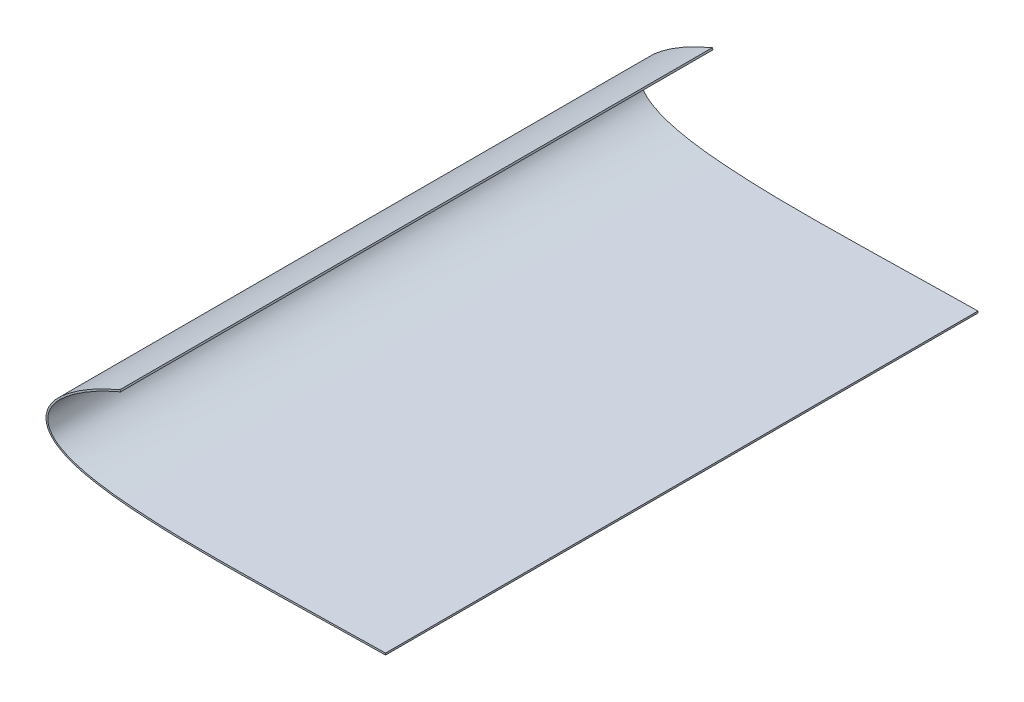
ISO-10303-21;
HEADER;
FILE_DESCRIPTION(('STEP AP214'),'2;1');
FILE_NAME('part.step','',(''),(''),'','','');
FILE_SCHEMA(('AUTOMOTIVE_DESIGN { 1 0 10303 214 1 1 1 1 }'));
ENDSEC;
DATA;
#1=APPLICATION_CONTEXT('core data for automotive mechanical design processes');
#2=APPLICATION_PROTOCOL_DEFINITION('international standard','automotive_design',2000,#1);
#3=PRODUCT_CONTEXT('',#1,'mechanical');
#4=PRODUCT('Part','Part','',(#3));
#5=PRODUCT_RELATED_PRODUCT_CATEGORY('part','',(#4));
#6=PRODUCT_DEFINITION_FORMATION('','',#4);
#7=PRODUCT_DEFINITION_CONTEXT('part definition',#1,'design');
#8=PRODUCT_DEFINITION('design','',#6,#7);
#9=PRODUCT_DEFINITION_SHAPE('','',#8);
#10=(LENGTH_UNIT() NAMED_UNIT(*) SI_UNIT(.MILLI.,.METRE.));
#11=(NAMED_UNIT(*) PLANE_ANGLE_UNIT() SI_UNIT($,.RADIAN.));
#12=(NAMED_UNIT(*) SI_UNIT($,.STERADIAN.) SOLID_ANGLE_UNIT());
#13=UNCERTAINTY_MEASURE_WITH_UNIT(LENGTH_MEASURE(1.E-05),#10,'distance_accuracy_value','');
#14=(GEOMETRIC_REPRESENTATION_CONTEXT(3) GLOBAL_UNCERTAINTY_ASSIGNED_CONTEXT((#13)) GLOBAL_UNIT_ASSIGNED_CONTEXT((#10,
#11,#12)) REPRESENTATION_CONTEXT('',''));
#15=CARTESIAN_POINT('',(0.,0.,0.));
#16=DIRECTION('',(0.,0.,1.));
#17=DIRECTION('',(1.,0.,0.));
#18=AXIS2_PLACEMENT_3D('',#15,#16,#17);
#19=CARTESIAN_POINT('',(52.279784263396,54.6368495583963,174.625));
#20=CARTESIAN_POINT('',(51.9842375839482,54.5110568205723,174.625));
#21=CARTESIAN_POINT('',(50.7698703349108,53.9873361103405,174.625));
#22=CARTESIAN_POINT('',(48.7262842208841,53.0365372041149,174.625));
#23=CARTESIAN_POINT('',(46.1985966340727,51.7856149808949,174.625));
#24=CARTESIAN_POINT('',(43.8513955335234,50.5628357336957,174.625));
#25=CARTESIAN_POINT('',(41.7065223147171,49.2753909988389,174.625));
#26=CARTESIAN_POINT('',(39.733394775625,48.0292859809215,174.625));
#27=CARTESIAN_POINT('',(37.9660150500307,46.7508633129765,174.625));
#28=CARTESIAN_POINT('',(36.3542569420481,45.5542620285061,174.625));
#29=CARTESIAN_POINT('',(34.9506042386984,44.3247206516308,174.625));
#30=CARTESIAN_POINT('',(33.7310058534112,43.1375529445579,174.625));
#31=CARTESIAN_POINT('',(32.6875400615619,41.9646967740159,174.625));
#32=CARTESIAN_POINT('',(31.8700494946095,40.7950980760292,174.625));
#33=CARTESIAN_POINT('',(31.2049081040977,39.6569207752362,174.625));
#34=CARTESIAN_POINT('',(30.8086033681005,38.5196104238674,174.625));
#35=CARTESIAN_POINT('',(30.5235691356459,37.4345389132446,174.625));
#36=CARTESIAN_POINT('',(30.4310087825791,36.3627840788217,174.625));
#37=CARTESIAN_POINT('',(30.615024145006,35.32934754233,174.625));
#38=CARTESIAN_POINT('',(30.8927865257014,34.3177616701598,174.625));
#39=CARTESIAN_POINT('',(31.4496102095806,33.3932258153343,174.625));
#40=CARTESIAN_POINT('',(32.1506525347102,32.5234150336729,174.625));
#41=CARTESIAN_POINT('',(32.9766589610015,31.6506119978175,174.625));
#42=CARTESIAN_POINT('',(34.0717450313561,30.9441424330286,174.625));
#43=CARTESIAN_POINT('',(35.2743301471047,30.2147424818531,174.625));
#44=CARTESIAN_POINT('',(36.6606910218293,29.5585884336969,174.625));
#45=CARTESIAN_POINT('',(38.2298639762326,28.9795874382233,174.625));
#46=CARTESIAN_POINT('',(39.9603274946295,28.409153359317,174.625));
#47=CARTESIAN_POINT('',(41.862111381165,27.9076892579437,174.625));
#48=CARTESIAN_POINT('',(43.9308294935862,27.4768136073615,174.625));
#49=CARTESIAN_POINT('',(46.1430586763678,27.0544798825399,174.625));
#50=CARTESIAN_POINT('',(48.5261088087182,26.711860726111,174.625));
#51=CARTESIAN_POINT('',(51.0445678607058,26.3949027035553,174.625));
#52=CARTESIAN_POINT('',(53.7226630674446,26.06649037235,174.625));
#53=CARTESIAN_POINT('',(56.5512320841555,25.9162004583246,174.625));
#54=CARTESIAN_POINT('',(59.5207885191564,25.6696578391719,174.625));
#55=CARTESIAN_POINT('',(62.6352898997253,25.564258659258,174.625));
#56=CARTESIAN_POINT('',(65.8829117322227,25.3781107864141,174.625));
#57=CARTESIAN_POINT('',(69.2727213948618,25.3117021246645,174.625));
#58=CARTESIAN_POINT('',(72.7875926931949,25.2447227423576,174.625));
#59=CARTESIAN_POINT('',(76.4410168529708,25.2177536800816,174.625));
#60=CARTESIAN_POINT('',(80.2079561151313,25.2059255566866,174.625));
#61=CARTESIAN_POINT('',(84.0995890603195,25.2542808010686,174.625));
#62=CARTESIAN_POINT('',(88.093376992889,25.2344045238007,174.625));
#63=CARTESIAN_POINT('',(92.2094832757753,25.3673234412305,174.625));
#64=CARTESIAN_POINT('',(96.427933938967,25.3704722092847,174.625));
#65=CARTESIAN_POINT('',(100.757397226996,25.4491366982306,174.625));
#66=CARTESIAN_POINT('',(105.17451648858,25.5547340767129,174.625));
#67=CARTESIAN_POINT('',(109.691566336199,25.6470871193837,174.625));
#68=CARTESIAN_POINT('',(114.294867366389,25.7362480016773,174.625));
#69=CARTESIAN_POINT('',(118.998236922616,25.8022193393076,174.625));
#70=CARTESIAN_POINT('',(123.786466612625,25.9376003922086,174.625));
#71=CARTESIAN_POINT('',(127.652050322274,25.978617474138,174.625));
#72=CARTESIAN_POINT('',(129.916088327162,26.0062875546644,174.625));
#73=CARTESIAN_POINT('',(130.555209424101,26.0143218854273,174.625));
#74=B_SPLINE_CURVE_WITH_KNOTS('',3,(#19,#20,#21,#22,#23,#24,#25,#26,#27,#28,#29,#30,#31,#32,#33,
#34,#35,#36,#37,#38,#39,#40,#41,#42,#43,#44,#45,#46,#47,#48,#49,#50,#51,#52,#53,#54,#55,#56,#57,
#58,#59,#60,#61,#62,#63,#64,#65,#66,#67,#68,#69,#70,#71,#72,#73),.UNSPECIFIED.,.F.,.F.,(4,1,1,1,
1,1,1,1,1,1,1,1,1,1,1,1,1,1,1,1,1,1,1,1,1,1,1,1,1,1,1,1,1,1,1,1,1,1,1,1,1,1,1,1,1,1,1,1,1,1,1,1,
4),(14.1344292083141,14.1723678306515,14.2906368426527,14.4005642750807,14.5054914593558,
14.6030933056501,14.6959497647682,14.7810065128842,14.8606668744199,14.932933187457,
15.0011950186659,15.0616397239758,15.1179775656103,15.1695757089876,15.2167045451708,
15.2596692469617,15.3020092469619,15.3423908516848,15.383061745454,15.4251745843519,
15.4685835050936,15.5151435437538,15.5662226823522,15.6217218895538,15.681367848344,
15.7469541944843,15.8191910050454,15.8965021064469,15.9790921784904,16.0687366540585,
16.162461376517,16.2633705099003,16.3685817203289,16.4810017203293,16.59780172033,
16.7204764773092,16.848989654843,16.9819779445536,17.1208699169633,17.2642178294,
17.4134881037355,17.5657766719204,17.7238886727302,17.8851509435814,18.0521088221016,
18.2220969675706,18.3965776576198,18.5739661555559,18.7557170983324,18.9403767994038,
19.1295299278471,19.3214630182723,19.3969558554318),.UNSPECIFIED.);
#75=DIRECTION('',(0.,0.,-1.));
#76=VECTOR('',#75,1.);
#77=SURFACE_OF_LINEAR_EXTRUSION('',#74,#76);
#78=CARTESIAN_POINT('',(52.279784263396,54.6368495583963,0.));
#79=CARTESIAN_POINT('',(51.9842375839482,54.5110568205723,0.));
#80=CARTESIAN_POINT('',(50.7698703349108,53.9873361103405,0.));
#81=CARTESIAN_POINT('',(48.7262842208841,53.0365372041149,0.));
#82=CARTESIAN_POINT('',(46.1985966340727,51.7856149808949,0.));
#83=CARTESIAN_POINT('',(43.8513955335234,50.5628357336957,0.));
#84=CARTESIAN_POINT('',(41.7065223147171,49.2753909988389,0.));
#85=CARTESIAN_POINT('',(39.733394775625,48.0292859809215,0.));
#86=CARTESIAN_POINT('',(37.9660150500307,46.7508633129765,0.));
#87=CARTESIAN_POINT('',(36.3542569420481,45.5542620285061,0.));
#88=CARTESIAN_POINT('',(34.9506042386984,44.3247206516308,0.));
#89=CARTESIAN_POINT('',(33.7310058534112,43.1375529445579,0.));
#90=CARTESIAN_POINT('',(32.6875400615619,41.9646967740159,0.));
#91=CARTESIAN_POINT('',(31.8700494946095,40.7950980760292,0.));
#92=CARTESIAN_POINT('',(31.2049081040977,39.6569207752362,0.));
#93=CARTESIAN_POINT('',(30.8086033681005,38.5196104238674,0.));
#94=CARTESIAN_POINT('',(30.5235691356459,37.4345389132446,0.));
#95=CARTESIAN_POINT('',(30.4310087825791,36.3627840788217,0.));
#96=CARTESIAN_POINT('',(30.615024145006,35.32934754233,0.));
#97=CARTESIAN_POINT('',(30.8927865257014,34.3177616701598,0.));
#98=CARTESIAN_POINT('',(31.4496102095806,33.3932258153343,0.));
#99=CARTESIAN_POINT('',(32.1506525347102,32.5234150336729,0.));
#100=CARTESIAN_POINT('',(32.9766589610015,31.6506119978175,0.));
#101=CARTESIAN_POINT('',(34.0717450313561,30.9441424330286,0.));
#102=CARTESIAN_POINT('',(35.2743301471047,30.2147424818531,0.));
#103=CARTESIAN_POINT('',(36.6606910218293,29.5585884336969,0.));
#104=CARTESIAN_POINT('',(38.2298639762326,28.9795874382233,0.));
#105=CARTESIAN_POINT('',(39.9603274946295,28.409153359317,0.));
#106=CARTESIAN_POINT('',(41.862111381165,27.9076892579437,0.));
#107=CARTESIAN_POINT('',(43.9308294935862,27.4768136073615,0.));
#108=CARTESIAN_POINT('',(46.1430586763678,27.0544798825399,0.));
#109=CARTESIAN_POINT('',(48.5261088087182,26.711860726111,0.));
#110=CARTESIAN_POINT('',(51.0445678607058,26.3949027035553,0.));
#111=CARTESIAN_POINT('',(53.7226630674446,26.06649037235,0.));
#112=CARTESIAN_POINT('',(56.5512320841555,25.9162004583246,0.));
#113=CARTESIAN_POINT('',(59.5207885191564,25.6696578391719,0.));
#114=CARTESIAN_POINT('',(62.6352898997253,25.564258659258,0.));
#115=CARTESIAN_POINT('',(65.8829117322227,25.3781107864141,0.));
#116=CARTESIAN_POINT('',(69.2727213948618,25.3117021246645,0.));
#117=CARTESIAN_POINT('',(72.7875926931949,25.2447227423576,0.));
#118=CARTESIAN_POINT('',(76.4410168529708,25.2177536800816,0.));
#119=CARTESIAN_POINT('',(80.2079561151313,25.2059255566866,0.));
#120=CARTESIAN_POINT('',(84.0995890603195,25.2542808010686,0.));
#121=CARTESIAN_POINT('',(88.093376992889,25.2344045238007,0.));
#122=CARTESIAN_POINT('',(92.2094832757753,25.3673234412305,0.));
#123=CARTESIAN_POINT('',(96.427933938967,25.3704722092847,0.));
#124=CARTESIAN_POINT('',(100.757397226996,25.4491366982306,0.));
#125=CARTESIAN_POINT('',(105.17451648858,25.5547340767129,0.));
#126=CARTESIAN_POINT('',(109.691566336199,25.6470871193837,0.));
#127=CARTESIAN_POINT('',(114.294867366389,25.7362480016773,0.));
#128=CARTESIAN_POINT('',(118.998236922616,25.8022193393076,0.));
#129=CARTESIAN_POINT('',(123.786466612625,25.9376003922086,0.));
#130=CARTESIAN_POINT('',(127.652050322274,25.978617474138,0.));
#131=CARTESIAN_POINT('',(129.916088327162,26.0062875546644,0.));
#132=CARTESIAN_POINT('',(130.555209424101,26.0143218854273,0.));
#133=B_SPLINE_CURVE_WITH_KNOTS('',3,(#78,#79,#80,#81,#82,#83,#84,#85,#86,#87,#88,#89,#90,#91,
#92,#93,#94,#95,#96,#97,#98,#99,#100,#101,#102,#103,#104,#105,#106,#107,#108,#109,#110,#111,
#112,#113,#114,#115,#116,#117,#118,#119,#120,#121,#122,#123,#124,#125,#126,#127,#128,#129,#130,
#131,#132),.UNSPECIFIED.,.F.,.F.,(4,1,1,1,1,1,1,1,1,1,1,1,1,1,1,1,1,1,1,1,1,1,1,1,1,1,1,1,1,1,1,
1,1,1,1,1,1,1,1,1,1,1,1,1,1,1,1,1,1,1,1,1,4),(14.1344292083141,14.1723678306515,
14.2906368426527,14.4005642750807,14.5054914593558,14.6030933056501,14.6959497647682,
14.7810065128842,14.8606668744199,14.932933187457,15.0011950186659,15.0616397239758,
15.1179775656103,15.1695757089876,15.2167045451708,15.2596692469617,15.3020092469619,
15.3423908516848,15.383061745454,15.4251745843519,15.4685835050936,15.5151435437538,
15.5662226823522,15.6217218895538,15.681367848344,15.7469541944843,15.8191910050454,
15.8965021064469,15.9790921784904,16.0687366540585,16.162461376517,16.2633705099003,
16.3685817203289,16.4810017203293,16.59780172033,16.7204764773092,16.848989654843,
16.9819779445536,17.1208699169633,17.2642178294,17.4134881037355,17.5657766719204,
17.7238886727302,17.8851509435814,18.0521088221016,18.2220969675706,18.3965776576198,
18.5739661555559,18.7557170983324,18.9403767994038,19.1295299278471,19.3214630182723,
19.3969558554318),.UNSPECIFIED.);
#134=CARTESIAN_POINT('',(52.279784263396,54.6368495583963,0.));
#135=VERTEX_POINT('',#134);
#136=CARTESIAN_POINT('',(130.555209424101,26.0143218854273,0.));
#137=VERTEX_POINT('',#136);
#138=EDGE_CURVE('E116',#135,#137,#133,.T.);
#139=ORIENTED_EDGE('',*,*,#138,.T.);
#140=DIRECTION('',(0.,0.,-1.));
#141=VECTOR('',#140,1.);
#142=CARTESIAN_POINT('',(130.555209424101,26.0143218854273,174.625));
#143=LINE('',#142,#141);
#144=CARTESIAN_POINT('',(130.555209424101,26.0143218854273,174.625));
#145=VERTEX_POINT('',#144);
#146=EDGE_CURVE('E11',#145,#137,#143,.T.);
#147=ORIENTED_EDGE('',*,*,#146,.F.);
#148=CARTESIAN_POINT('',(52.279784263396,54.6368495583963,174.625));
#149=VERTEX_POINT('',#148);
#150=EDGE_CURVE('E85',#149,#145,#74,.T.);
#151=ORIENTED_EDGE('',*,*,#150,.F.);
#152=DIRECTION('',(0.,0.,-1.));
#153=VECTOR('',#152,1.);
#154=CARTESIAN_POINT('',(52.279784263396,54.6368495583963,174.625));
#155=LINE('',#154,#153);
#156=EDGE_CURVE('E93',#149,#135,#155,.T.);
#157=ORIENTED_EDGE('',*,*,#156,.T.);
#158=EDGE_LOOP('',(#139,#147,#151,#157));
#159=FACE_BOUND('',#158,.T.);
#160=ADVANCED_FACE('F33',(#159),#77,.F.);
#161=CARTESIAN_POINT('',(130.548667937939,26.5346890341615,174.625));
#162=DIRECTION('',(-0.999920995533172,-0.0125699121695554,0.));
#163=DIRECTION('',(0.0125699121695555,-0.999920995533172,0.));
#164=AXIS2_PLACEMENT_3D('',#161,#162,#163);
#165=PLANE('',#164);
#166=DIRECTION('',(-0.0125699121695554,0.999920995533172,0.));
#167=VECTOR('',#166,1.);
#168=CARTESIAN_POINT('',(130.548667937939,26.5346890341615,0.));
#169=LINE('',#168,#167);
#170=CARTESIAN_POINT('',(130.548667937939,26.5346890341615,0.));
#171=VERTEX_POINT('',#170);
#172=EDGE_CURVE('E89',#137,#171,#169,.T.);
#173=ORIENTED_EDGE('',*,*,#172,.T.);
#174=DIRECTION('',(0.,0.,-1.));
#175=VECTOR('',#174,1.);
#176=CARTESIAN_POINT('',(130.548667937939,26.5346890341615,174.625));
#177=LINE('',#176,#175);
#178=CARTESIAN_POINT('',(130.548667937939,26.5346890341615,174.625));
#179=VERTEX_POINT('',#178);
#180=EDGE_CURVE('E42',#179,#171,#177,.T.);
#181=ORIENTED_EDGE('',*,*,#180,.F.);
#182=DIRECTION('',(-0.0125699121695554,0.999920995533172,0.));
#183=VECTOR('',#182,1.);
#184=CARTESIAN_POINT('',(130.548667937939,26.5346890341615,174.625));
#185=LINE('',#184,#183);
#186=EDGE_CURVE('E80',#145,#179,#185,.T.);
#187=ORIENTED_EDGE('',*,*,#186,.F.);
#188=ORIENTED_EDGE('',*,*,#146,.T.);
#189=EDGE_LOOP('',(#173,#181,#187,#188));
#190=FACE_BOUND('',#189,.T.);
#191=ADVANCED_FACE('F88',(#190),#165,.F.);
#192=CARTESIAN_POINT('',(130.548667937939,26.5346890341615,174.625));
#193=CARTESIAN_POINT('',(124.555343756834,26.4491026396697,174.625));
#194=CARTESIAN_POINT('',(118.563284111257,26.3143159513226,174.625));
#195=CARTESIAN_POINT('',(102.663997770162,26.0308132515019,174.625));
#196=CARTESIAN_POINT('',(92.7642170680979,25.8004249943056,174.625));
#197=CARTESIAN_POINT('',(77.9969063518174,25.7164614683827,174.625));
#198=CARTESIAN_POINT('',(73.1544000856876,25.7277180879495,174.625));
#199=CARTESIAN_POINT('',(63.4698219147655,25.9577443343307,174.625));
#200=CARTESIAN_POINT('',(58.6332063621148,26.2110915671319,174.625));
#201=CARTESIAN_POINT('',(51.4046880593991,26.8525814791273,174.625));
#202=CARTESIAN_POINT('',(49.0055614718312,27.1183583047564,174.625));
#203=CARTESIAN_POINT('',(44.2531218048478,27.8939248842433,174.625));
#204=CARTESIAN_POINT('',(41.8889325759947,28.3539185666942,174.625));
#205=CARTESIAN_POINT('',(38.5092631099543,29.4115926421441,174.625));
#206=CARTESIAN_POINT('',(37.4227007969777,29.7823005654821,174.625));
#207=CARTESIAN_POINT('',(35.3858591876671,30.721401098096,174.625));
#208=CARTESIAN_POINT('',(34.3648285070924,31.2789602327156,174.625));
#209=CARTESIAN_POINT('',(32.4947462546347,32.7613334870106,174.625));
#210=CARTESIAN_POINT('',(31.6368907574047,33.8105567726051,174.625));
#211=CARTESIAN_POINT('',(30.8417084343807,36.1863154881374,174.625));
#212=CARTESIAN_POINT('',(30.9740163157737,37.4872010536399,174.625));
#213=CARTESIAN_POINT('',(32.1505911551316,40.6939371356345,174.625));
#214=CARTESIAN_POINT('',(33.6489329297031,42.4217978213159,174.625));
#215=CARTESIAN_POINT('',(37.2937741895299,45.7686663906626,174.625));
#216=CARTESIAN_POINT('',(39.569261895129,47.3620885973542,174.625));
#217=CARTESIAN_POINT('',(45.1489216631899,50.7908001205631,174.625));
#218=CARTESIAN_POINT('',(48.5985134973385,52.4662096211677,174.625));
#219=CARTESIAN_POINT('',(52.2115751343648,54.0523162100325,174.625));
#220=CARTESIAN_POINT('',(52.3312267033242,54.1046027201561,174.625));
#221=CARTESIAN_POINT('',(52.4509665908119,54.1566903924833,174.625));
#222=B_SPLINE_CURVE_WITH_KNOTS('',3,(#192,#193,#194,#195,#196,#197,#198,#199,#200,#201,#202,
#203,#204,#205,#206,#207,#208,#209,#210,#211,#212,#213,#214,#215,#216,#217,#218,#219,#220,#221),
.UNSPECIFIED.,.F.,.F.,(4,2,2,2,2,2,2,2,2,2,2,2,2,2,4),(14.135708649313,14.8434402693259,
16.0140470282882,16.5870564413242,17.1600658543601,17.446570560878,17.733075267396,
17.8698354280187,18.0065955886415,18.1697632211686,18.3329308536956,18.6002796477227,
18.9285117511339,19.3814841253363,19.3969867417204),.UNSPECIFIED.);
#223=DIRECTION('',(0.,0.,-1.));
#224=VECTOR('',#223,1.);
#225=SURFACE_OF_LINEAR_EXTRUSION('',#222,#224);
#226=CARTESIAN_POINT('',(130.548667937939,26.5346890341615,0.));
#227=CARTESIAN_POINT('',(124.555343756834,26.4491026396697,0.));
#228=CARTESIAN_POINT('',(118.563284111257,26.3143159513226,0.));
#229=CARTESIAN_POINT('',(102.663997770162,26.0308132515019,0.));
#230=CARTESIAN_POINT('',(92.7642170680979,25.8004249943056,0.));
#231=CARTESIAN_POINT('',(77.9969063518174,25.7164614683827,0.));
#232=CARTESIAN_POINT('',(73.1544000856876,25.7277180879495,0.));
#233=CARTESIAN_POINT('',(63.4698219147655,25.9577443343307,0.));
#234=CARTESIAN_POINT('',(58.6332063621148,26.2110915671319,0.));
#235=CARTESIAN_POINT('',(51.4046880593991,26.8525814791273,0.));
#236=CARTESIAN_POINT('',(49.0055614718312,27.1183583047564,0.));
#237=CARTESIAN_POINT('',(44.2531218048478,27.8939248842433,0.));
#238=CARTESIAN_POINT('',(41.8889325759947,28.3539185666942,0.));
#239=CARTESIAN_POINT('',(38.5092631099543,29.4115926421441,0.));
#240=CARTESIAN_POINT('',(37.4227007969777,29.7823005654821,0.));
#241=CARTESIAN_POINT('',(35.3858591876671,30.721401098096,0.));
#242=CARTESIAN_POINT('',(34.3648285070924,31.2789602327156,0.));
#243=CARTESIAN_POINT('',(32.4947462546347,32.7613334870106,0.));
#244=CARTESIAN_POINT('',(31.6368907574047,33.8105567726051,0.));
#245=CARTESIAN_POINT('',(30.8417084343807,36.1863154881374,0.));
#246=CARTESIAN_POINT('',(30.9740163157737,37.4872010536399,0.));
#247=CARTESIAN_POINT('',(32.1505911551316,40.6939371356345,0.));
#248=CARTESIAN_POINT('',(33.6489329297031,42.4217978213159,0.));
#249=CARTESIAN_POINT('',(37.2937741895299,45.7686663906626,0.));
#250=CARTESIAN_POINT('',(39.569261895129,47.3620885973542,0.));
#251=CARTESIAN_POINT('',(45.1489216631899,50.7908001205631,0.));
#252=CARTESIAN_POINT('',(48.5985134973385,52.4662096211677,0.));
#253=CARTESIAN_POINT('',(52.2115751343648,54.0523162100325,0.));
#254=CARTESIAN_POINT('',(52.3312267033242,54.1046027201561,0.));
#255=CARTESIAN_POINT('',(52.4509665908119,54.1566903924833,0.));
#256=B_SPLINE_CURVE_WITH_KNOTS('',3,(#226,#227,#228,#229,#230,#231,#232,#233,#234,#235,#236,
#237,#238,#239,#240,#241,#242,#243,#244,#245,#246,#247,#248,#249,#250,#251,#252,#253,#254,#255),
.UNSPECIFIED.,.F.,.F.,(4,2,2,2,2,2,2,2,2,2,2,2,2,2,4),(14.135708649313,14.8434402693259,
16.0140470282882,16.5870564413242,17.1600658543601,17.446570560878,17.733075267396,
17.8698354280187,18.0065955886415,18.1697632211686,18.3329308536956,18.6002796477227,
18.9285117511339,19.3814841253363,19.3969867417204),.UNSPECIFIED.);
#257=CARTESIAN_POINT('',(52.4509665908119,54.1566903924833,0.));
#258=VERTEX_POINT('',#257);
#259=EDGE_CURVE('E67',#171,#258,#256,.T.);
#260=ORIENTED_EDGE('',*,*,#259,.T.);
#261=DIRECTION('',(0.,0.,-1.));
#262=VECTOR('',#261,1.);
#263=CARTESIAN_POINT('',(52.4509665908119,54.1566903924833,174.625));
#264=LINE('',#263,#262);
#265=CARTESIAN_POINT('',(52.4509665908119,54.1566903924833,174.625));
#266=VERTEX_POINT('',#265);
#267=EDGE_CURVE('E90',#266,#258,#264,.T.);
#268=ORIENTED_EDGE('',*,*,#267,.F.);
#269=EDGE_CURVE('E83',#179,#266,#222,.T.);
#270=ORIENTED_EDGE('',*,*,#269,.F.);
#271=ORIENTED_EDGE('',*,*,#180,.T.);
#272=EDGE_LOOP('',(#260,#268,#270,#271));
#273=FACE_BOUND('',#272,.T.);
#274=ADVANCED_FACE('F91',(#273),#225,.F.);
#275=CARTESIAN_POINT('',(52.4509665908119,54.1566903924833,174.625));
#276=DIRECTION('',(-0.941930089566212,-0.335809032591125,0.));
#277=DIRECTION('',(0.335809032591125,-0.941930089566212,0.));
#278=AXIS2_PLACEMENT_3D('',#275,#276,#277);
#279=PLANE('',#278);
#280=DIRECTION('',(-0.335809032591125,0.941930089566213,0.));
#281=VECTOR('',#280,1.);
#282=CARTESIAN_POINT('',(52.4509665908119,54.1566903924833,0.));
#283=LINE('',#282,#281);
#284=EDGE_CURVE('E73',#258,#135,#283,.T.);
#285=ORIENTED_EDGE('',*,*,#284,.T.);
#286=ORIENTED_EDGE('',*,*,#156,.F.);
#287=DIRECTION('',(-0.335809032591125,0.941930089566213,0.));
#288=VECTOR('',#287,1.);
#289=CARTESIAN_POINT('',(52.4509665908119,54.1566903924833,174.625));
#290=LINE('',#289,#288);
#291=EDGE_CURVE('E50',#266,#149,#290,.T.);
#292=ORIENTED_EDGE('',*,*,#291,.F.);
#293=ORIENTED_EDGE('',*,*,#267,.T.);
#294=EDGE_LOOP('',(#285,#286,#292,#293));
#295=FACE_BOUND('',#294,.T.);
#296=ADVANCED_FACE('F105',(#295),#279,.F.);
#297=CARTESIAN_POINT('',(63.7324862428104,25.4986905160754,174.625));
#298=DIRECTION('',(0.,0.,-1.));
#299=DIRECTION('',(-1.,0.,0.));
#300=AXIS2_PLACEMENT_3D('',#297,#298,#299);
#301=PLANE('',#300);
#302=ORIENTED_EDGE('',*,*,#150,.T.);
#303=ORIENTED_EDGE('',*,*,#186,.T.);
#304=ORIENTED_EDGE('',*,*,#269,.T.);
#305=ORIENTED_EDGE('',*,*,#291,.T.);
#306=EDGE_LOOP('',(#302,#303,#304,#305));
#307=FACE_BOUND('',#306,.T.);
#308=ADVANCED_FACE('F81',(#307),#301,.F.);
#309=CARTESIAN_POINT('',(63.7324862428104,25.4986905160754,0.));
#310=DIRECTION('',(0.,0.,-1.));
#311=DIRECTION('',(-1.,0.,0.));
#312=AXIS2_PLACEMENT_3D('',#309,#310,#311);
#313=PLANE('',#312);
#314=ORIENTED_EDGE('',*,*,#138,.F.);
#315=ORIENTED_EDGE('',*,*,#284,.F.);
#316=ORIENTED_EDGE('',*,*,#259,.F.);
#317=ORIENTED_EDGE('',*,*,#172,.F.);
#318=EDGE_LOOP('',(#314,#315,#316,#317));
#319=FACE_BOUND('',#318,.T.);
#320=ADVANCED_FACE('F133',(#319),#313,.T.);
#321=CLOSED_SHELL('',(#160,#191,#274,#296,#308,#320));
#322=MANIFOLD_SOLID_BREP('B2',#321);
#323=ADVANCED_BREP_SHAPE_REPRESENTATION('',(#18,#322),#14);
#324=SHAPE_DEFINITION_REPRESENTATION(#9,#323);
ENDSEC;
END-ISO-10303-21;
